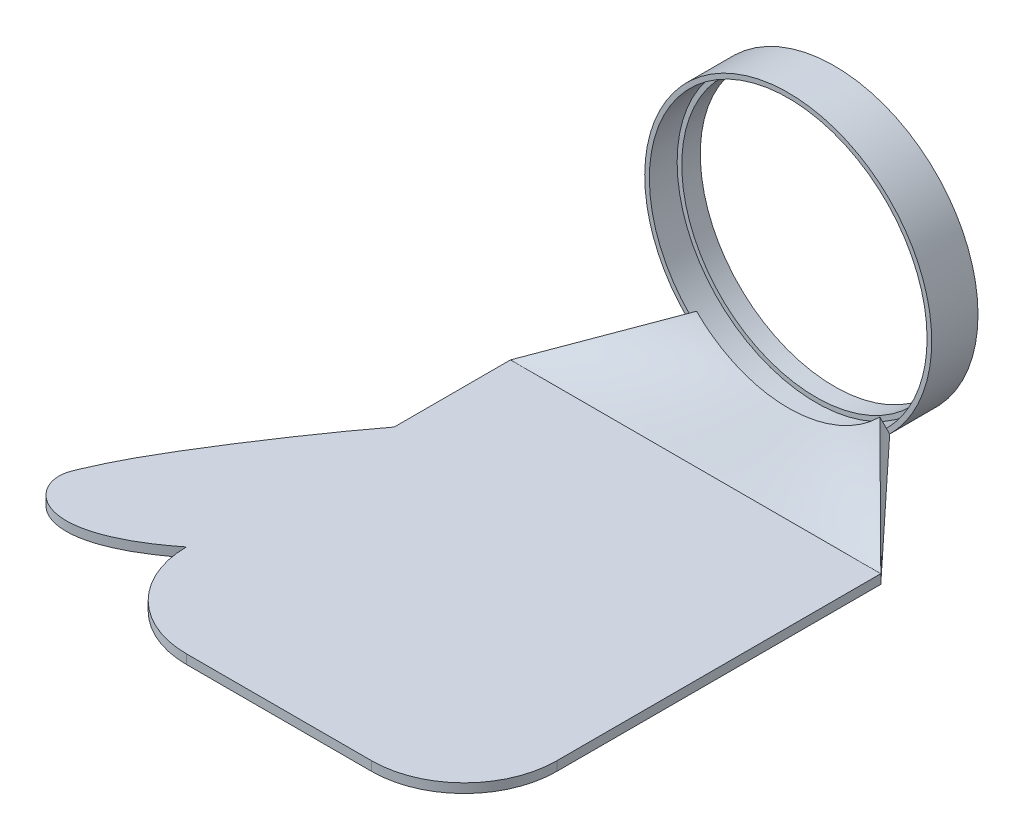
ISO-10303-21;
HEADER;
FILE_DESCRIPTION(('STEP AP214'),'2;1');
FILE_NAME('part.step','',(''),(''),'','','');
FILE_SCHEMA(('AUTOMOTIVE_DESIGN { 1 0 10303 214 1 1 1 1 }'));
ENDSEC;
DATA;
#1=APPLICATION_CONTEXT('core data for automotive mechanical design processes');
#2=APPLICATION_PROTOCOL_DEFINITION('international standard','automotive_design',2000,#1);
#3=PRODUCT_CONTEXT('',#1,'mechanical');
#4=PRODUCT('Part','Part','',(#3));
#5=PRODUCT_RELATED_PRODUCT_CATEGORY('part','',(#4));
#6=PRODUCT_DEFINITION_FORMATION('','',#4);
#7=PRODUCT_DEFINITION_CONTEXT('part definition',#1,'design');
#8=PRODUCT_DEFINITION('design','',#6,#7);
#9=PRODUCT_DEFINITION_SHAPE('','',#8);
#10=(LENGTH_UNIT() NAMED_UNIT(*) SI_UNIT(.MILLI.,.METRE.));
#11=(NAMED_UNIT(*) PLANE_ANGLE_UNIT() SI_UNIT($,.RADIAN.));
#12=(NAMED_UNIT(*) SI_UNIT($,.STERADIAN.) SOLID_ANGLE_UNIT());
#13=UNCERTAINTY_MEASURE_WITH_UNIT(LENGTH_MEASURE(1.E-05),#10,'distance_accuracy_value','');
#14=(GEOMETRIC_REPRESENTATION_CONTEXT(3) GLOBAL_UNCERTAINTY_ASSIGNED_CONTEXT((#13)) GLOBAL_UNIT_ASSIGNED_CONTEXT((#10,
#11,#12)) REPRESENTATION_CONTEXT('',''));
#15=CARTESIAN_POINT('',(0.,0.,0.));
#16=DIRECTION('',(0.,0.,1.));
#17=DIRECTION('',(1.,0.,0.));
#18=AXIS2_PLACEMENT_3D('',#15,#16,#17);
#19=CARTESIAN_POINT('',(0.,0.,5.));
#20=DIRECTION('',(0.,0.,1.));
#21=DIRECTION('',(1.,0.,0.));
#22=AXIS2_PLACEMENT_3D('',#19,#20,#21);
#23=PLANE('',#22);
#24=CARTESIAN_POINT('',(10.9601551083915,-10.9601551083915,5.));
#25=CARTESIAN_POINT('',(11.1396797140786,-10.7806732913506,5.));
#26=CARTESIAN_POINT('',(11.3148051119656,-10.5967872776614,5.));
#27=CARTESIAN_POINT('',(11.6554248805663,-10.2210508058151,5.));
#28=CARTESIAN_POINT('',(11.820939900256,-10.0292190651756,5.));
#29=CARTESIAN_POINT('',(12.1423419068784,-9.63759345242739,5.));
#30=CARTESIAN_POINT('',(12.298227138055,-9.43779813921744,5.));
#31=CARTESIAN_POINT('',(12.600400333795,-9.030273703139,5.));
#32=CARTESIAN_POINT('',(12.7466622748356,-8.82252529182297,5.));
#33=CARTESIAN_POINT('',(13.0288191444432,-8.40026650995938,5.));
#34=CARTESIAN_POINT('',(13.1647196545231,-8.18575986922739,5.));
#35=CARTESIAN_POINT('',(13.425502533184,-7.75079971758814,5.));
#36=CARTESIAN_POINT('',(13.5504088466001,-7.53036056821244,5.));
#37=CARTESIAN_POINT('',(13.7892300068208,-7.08355529698752,5.));
#38=CARTESIAN_POINT('',(13.9031428513517,-6.85718810495524,5.));
#39=CARTESIAN_POINT('',(14.1200065590072,-6.39854366498906,5.));
#40=CARTESIAN_POINT('',(14.2229281322285,-6.16625257349241,5.));
#41=CARTESIAN_POINT('',(14.4172846377865,-5.69706114298184,5.));
#42=CARTESIAN_POINT('',(14.5087257718417,-5.46016337306585,5.));
#43=CARTESIAN_POINT('',(14.6796412941002,-4.98268468083537,5.));
#44=CARTESIAN_POINT('',(14.7591419691489,-4.742113172878,5.));
#45=CARTESIAN_POINT('',(14.9062069418913,-4.25730144905169,5.));
#46=CARTESIAN_POINT('',(14.9737690670359,-4.01306057419636,5.));
#47=CARTESIAN_POINT('',(15.0969883642954,-3.52092078428873,5.));
#48=CARTESIAN_POINT('',(15.1526141069755,-3.27301400553592,5.));
#49=CARTESIAN_POINT('',(15.2517094701977,-2.77488709154146,5.));
#50=CARTESIAN_POINT('',(15.2951840157062,-2.52466793612694,5.));
#51=CARTESIAN_POINT('',(15.3696725891579,-2.02297442055554,5.));
#52=CARTESIAN_POINT('',(15.4007153621291,-1.77150433318205,5.));
#53=CARTESIAN_POINT('',(15.4503728172029,-1.26731712465585,5.));
#54=CARTESIAN_POINT('',(15.4689863696468,-1.01459989225569,5.));
#55=CARTESIAN_POINT('',(15.4938162589252,-0.507922784482301,5.));
#56=CARTESIAN_POINT('',(15.5000013359242,-0.253961382273287,5.));
#57=CARTESIAN_POINT('',(15.4999986644409,0.253891979022556,5.));
#58=CARTESIAN_POINT('',(15.4938142967758,0.50778393812028,5.));
#59=CARTESIAN_POINT('',(15.4689860677092,1.01436850617498,5.));
#60=CARTESIAN_POINT('',(15.4503711953102,1.26706253115691,5.));
#61=CARTESIAN_POINT('',(15.400712470744,1.77124941542882,5.));
#62=CARTESIAN_POINT('',(15.3696674888441,2.02274216343561,5.));
#63=CARTESIAN_POINT('',(15.2951824647361,2.52452863580036,5.));
#64=CARTESIAN_POINT('',(15.2517115025878,2.77481776539001,5.));
#65=CARTESIAN_POINT('',(15.1526523031044,3.27288108926576,5.));
#66=CARTESIAN_POINT('',(15.0970689925711,3.52065626336321,5.));
#67=CARTESIAN_POINT('',(14.9739067825486,4.01262080627993,5.));
#68=CARTESIAN_POINT('',(14.9063549686672,4.25681695123904,5.));
#69=CARTESIAN_POINT('',(14.7592880677599,4.74162806923374,5.));
#70=CARTESIAN_POINT('',(14.6797708081554,4.98224238317566,5.));
#71=CARTESIAN_POINT('',(14.5088059942086,5.45989877096893,5.));
#72=CARTESIAN_POINT('',(14.4173279399969,5.69692992263598,5.));
#73=CARTESIAN_POINT('',(14.2229903005675,6.1661291654081,5.));
#74=CARTESIAN_POINT('',(14.1201369172639,6.39829982516878,5.));
#75=CARTESIAN_POINT('',(13.9033640406105,6.85678378510566,5.));
#76=CARTESIAN_POINT('',(13.7894697917361,7.0831090158759,5.));
#77=CARTESIAN_POINT('',(13.550646695384,7.52991325952517,5.));
#78=CARTESIAN_POINT('',(13.4257158456836,7.750391202137,5.));
#79=CARTESIAN_POINT('',(13.1648499577192,8.18551598532972,5.));
#80=CARTESIAN_POINT('',(13.028887136339,8.40014616332075,5.));
#81=CARTESIAN_POINT('',(12.7467474024887,8.82241647898493,5.));
#82=CARTESIAN_POINT('',(12.6005760716388,9.03006034588864,5.));
#83=CARTESIAN_POINT('',(12.2985226433296,9.43744437546974,5.));
#84=CARTESIAN_POINT('',(12.1426629777432,9.63720116445356,5.));
#85=CARTESIAN_POINT('',(11.8212616159975,10.0288281148907,5.));
#86=CARTESIAN_POINT('',(11.6557181648867,10.2206968360275,5.));
#87=CARTESIAN_POINT('',(11.3149761078628,10.5965684084857,5.));
#88=CARTESIAN_POINT('',(11.1397535033878,10.7805494971669,5.));
#89=CARTESIAN_POINT('',(10.7806541535186,11.1396632755775,5.));
#90=CARTESIAN_POINT('',(10.5967821549586,11.3148007118015,5.));
#91=CARTESIAN_POINT('',(10.2210559170731,11.6554292708934,5.));
#92=CARTESIAN_POINT('',(10.0292204349668,11.8209410768391,5.));
#93=CARTESIAN_POINT('',(9.63759208239179,12.1423407300768,5.));
#94=CARTESIAN_POINT('',(9.4377977716841,12.2982268223533,5.));
#95=CARTESIAN_POINT('',(9.03027407163186,12.6004006503146,5.));
#96=CARTESIAN_POINT('',(8.82252539053157,12.746662359635,5.));
#97=CARTESIAN_POINT('',(8.40026641130496,13.0288190596895,5.));
#98=CARTESIAN_POINT('',(8.18575984280865,13.164719631777,5.));
#99=CARTESIAN_POINT('',(7.75079974394779,13.4255025558806,5.));
#100=CARTESIAN_POINT('',(7.53036057531935,13.5504088529069,5.));
#101=CARTESIAN_POINT('',(7.08355528987921,13.7892300005146,5.));
#102=CARTESIAN_POINT('',(6.85718810288884,13.903142848826,5.));
#103=CARTESIAN_POINT('',(6.39854366706075,14.1200065615408,5.));
#104=CARTESIAN_POINT('',(6.16625257464476,14.2229281360344,5.));
#105=CARTESIAN_POINT('',(5.69706114182945,14.4172846339829,5.));
#106=CARTESIAN_POINT('',(5.4601633705283,14.5087257591619,5.));
#107=CARTESIAN_POINT('',(4.98268468336393,14.6796413067518,5.));
#108=CARTESIAN_POINT('',(4.74211318184032,14.7591420159121,5.));
#109=CARTESIAN_POINT('',(4.25730144008322,14.9062068951197,5.));
#110=CARTESIAN_POINT('',(4.01306054085775,14.9737688925886,5.));
#111=CARTESIAN_POINT('',(3.52092081771079,15.0969885391967,5.));
#112=CARTESIAN_POINT('',(3.27301413038947,15.1526147604754,5.));
#113=CARTESIAN_POINT('',(2.77492100762224,15.2517020450993,5.));
#114=CARTESIAN_POINT('',(2.52473588201365,15.2951696922104,5.));
#115=CARTESIAN_POINT('',(2.02308784472048,15.3696496746441,5.));
#116=CARTESIAN_POINT('',(1.77162903819121,15.40068962827,5.));
#117=CARTESIAN_POINT('',(1.26744188346732,15.4503466182445,5.));
#118=CARTESIAN_POINT('',(1.01471331279208,15.4689613951971,5.));
#119=CARTESIAN_POINT('',(0.507990955891537,15.4938017137811,5.));
#120=CARTESIAN_POINT('',(0.253995588630871,15.4999948973562,5.));
#121=CARTESIAN_POINT('',(-0.253857784714123,15.5000050998754,5.));
#122=CARTESIAN_POINT('',(-0.50771579055831,15.4938288316171,5.));
#123=CARTESIAN_POINT('',(-1.01425512523439,15.4690110249383,5.));
#124=CARTESIAN_POINT('',(-1.26693781585405,15.4503973750194,5.));
#125=CARTESIAN_POINT('',(-1.77112475394009,15.400738185484,5.));
#126=CARTESIAN_POINT('',(-2.02262877882591,15.3696903864815,5.));
#127=CARTESIAN_POINT('',(-2.52446071347772,15.2951967775288,5.));
#128=CARTESIAN_POINT('',(-2.77478386115629,15.2517189228287,5.));
#129=CARTESIAN_POINT('',(-3.27288096475047,15.1526516511668,5.));
#130=CARTESIAN_POINT('',(-3.52065623003236,15.0970688180648,5.));
#131=CARTESIAN_POINT('',(-4.01262083953223,14.9739069566667,5.));
#132=CARTESIAN_POINT('',(-4.25681696014836,14.9063550153308,5.));
#133=CARTESIAN_POINT('',(-4.74162806031721,14.7592880210902,5.));
#134=CARTESIAN_POINT('',(-4.98224238078186,14.6797707956362,5.));
#135=CARTESIAN_POINT('',(-5.45989877336488,14.508806006762,5.));
#136=CARTESIAN_POINT('',(-5.69692992327742,14.4173279433597,5.));
#137=CARTESIAN_POINT('',(-6.16612916476628,14.2229902972069,5.));
#138=CARTESIAN_POINT('',(-6.39829982499703,14.1201369163643,5.));
#139=CARTESIAN_POINT('',(-6.85678378527719,13.903364041508,5.));
#140=CARTESIAN_POINT('',(-7.08310901592195,13.7894697919766,5.));
#141=CARTESIAN_POINT('',(-7.52991325947933,13.5506466951433,5.));
#142=CARTESIAN_POINT('',(-7.75039120212478,13.425715845619,5.));
#143=CARTESIAN_POINT('',(-8.18551598534214,13.1648499577839,5.));
#144=CARTESIAN_POINT('',(-8.40014616332409,13.0288871363563,5.));
#145=CARTESIAN_POINT('',(-8.82241647898164,12.7467474024713,5.));
#146=CARTESIAN_POINT('',(-9.0300603458878,12.6005760716341,5.));
#147=CARTESIAN_POINT('',(-9.43744437547069,12.2985226433342,5.));
#148=CARTESIAN_POINT('',(-9.63720116445388,12.1426629777443,5.));
#149=CARTESIAN_POINT('',(-10.0288281148906,11.8212616159962,5.));
#150=CARTESIAN_POINT('',(-10.2206968360275,11.6557181648863,5.));
#151=CARTESIAN_POINT('',(-10.5965684084858,11.3149761078631,5.));
#152=CARTESIAN_POINT('',(-10.7805494971669,11.1397535033879,5.));
#153=CARTESIAN_POINT('',(-11.1396632755765,10.7806541535195,5.));
#154=CARTESIAN_POINT('',(-11.3148007117997,10.5967821549604,5.));
#155=CARTESIAN_POINT('',(-11.6554292708903,10.2210559170762,5.));
#156=CARTESIAN_POINT('',(-11.8209410768357,10.0292204349702,5.));
#157=CARTESIAN_POINT('',(-12.1423407300733,9.63759208239517,5.));
#158=CARTESIAN_POINT('',(-12.2982268223501,9.43779777168715,5.));
#159=CARTESIAN_POINT('',(-12.6004006503127,9.03027407163371,5.));
#160=CARTESIAN_POINT('',(-12.7466623596341,8.82252539053252,5.));
#161=CARTESIAN_POINT('',(-13.0288190596887,8.4002664113065,5.));
#162=CARTESIAN_POINT('',(-13.1647196317756,8.18575984281178,5.));
#163=CARTESIAN_POINT('',(-13.4255025558782,7.75079974395302,5.));
#164=CARTESIAN_POINT('',(-13.5504088529043,7.53036057532508,5.));
#165=CARTESIAN_POINT('',(-13.7892300005119,7.08355528988492,5.));
#166=CARTESIAN_POINT('',(-13.9031428488235,6.85718810289402,5.));
#167=CARTESIAN_POINT('',(-14.1200065615394,6.39854366706387,5.));
#168=CARTESIAN_POINT('',(-14.2229281360337,6.16625257464633,5.));
#169=CARTESIAN_POINT('',(-14.4172846339826,5.69706114183023,5.));
#170=CARTESIAN_POINT('',(-14.5087257591614,5.46016337052988,5.));
#171=CARTESIAN_POINT('',(-14.679641306751,4.98268468336656,5.));
#172=CARTESIAN_POINT('',(-14.7591420159112,4.7421131818432,5.));
#173=CARTESIAN_POINT('',(-14.9062068951188,4.2573014400861,5.));
#174=CARTESIAN_POINT('',(-14.9737688925877,4.01306054086036,5.));
#175=CARTESIAN_POINT('',(-15.0969885391963,3.52092081771237,5.));
#176=CARTESIAN_POINT('',(-15.1526147604752,3.27301413039027,5.));
#177=CARTESIAN_POINT('',(-15.2517020450993,2.77492100762267,5.));
#178=CARTESIAN_POINT('',(-15.2951696922104,2.5247358820145,5.));
#179=CARTESIAN_POINT('',(-15.3696496746441,2.02308784472189,5.));
#180=CARTESIAN_POINT('',(-15.40068962827,1.77162903819276,5.));
#181=CARTESIAN_POINT('',(-15.4503466182445,1.26744188346887,5.));
#182=CARTESIAN_POINT('',(-15.4689613951972,1.01471331279349,5.));
#183=CARTESIAN_POINT('',(-15.4938017137812,0.507990955892377,5.));
#184=CARTESIAN_POINT('',(-15.4999948973562,0.253995588631283,5.));
#185=CARTESIAN_POINT('',(-15.5000050998754,-0.253857784716043,5.));
#186=CARTESIAN_POINT('',(-15.4938288316171,-0.507715790562133,5.));
#187=CARTESIAN_POINT('',(-15.4690110249384,-1.01425512524086,5.));
#188=CARTESIAN_POINT('',(-15.4503973750195,-1.26693781586127,5.));
#189=CARTESIAN_POINT('',(-15.400738185484,-1.77112475394704,5.));
#190=CARTESIAN_POINT('',(-15.3696903864812,-2.02262877883185,5.));
#191=CARTESIAN_POINT('',(-15.2951967775293,-2.52446071348212,5.));
#192=CARTESIAN_POINT('',(-15.2517189228302,-2.77478386116018,5.));
#193=CARTESIAN_POINT('',(-15.1526516511647,-3.27288096474932,5.));
#194=CARTESIAN_POINT('',(-15.097068818058,-3.52065623002666,5.));
#195=CARTESIAN_POINT('',(-14.9739069566704,-4.01262083954204,5.));
#196=CARTESIAN_POINT('',(-14.9063550153497,-4.25681696017818,5.));
#197=CARTESIAN_POINT('',(-14.7592880210671,-4.74162806029306,5.));
#198=CARTESIAN_POINT('',(-14.679770795556,-4.98224238068372,5.));
#199=CARTESIAN_POINT('',(-14.5088060068394,-5.45989877346739,5.));
#200=CARTESIAN_POINT('',(-14.4173279436527,-5.69692992365548,5.));
#201=CARTESIAN_POINT('',(-14.2229902969149,-6.16612916438637,5.));
#202=CARTESIAN_POINT('',(-14.1201369152724,-6.39829982358434,5.));
#203=CARTESIAN_POINT('',(-13.9033640426049,-6.85678378667167,5.));
#204=CARTESIAN_POINT('',(-13.7894697960536,-7.08310902114547,5.));
#205=CARTESIAN_POINT('',(-13.5506466910757,-7.5299132542341,5.));
#206=CARTESIAN_POINT('',(-13.4257158304238,-7.75039118257841,5.));
#207=CARTESIAN_POINT('',(-13.1648499730259,-8.18551600492416,5.));
#208=CARTESIAN_POINT('',(-13.0288871933002,-8.40014623651187,5.));
#209=CARTESIAN_POINT('',(-12.7467473455613,-8.82241640582921,5.));
#210=CARTESIAN_POINT('',(-12.6005758592755,-9.03006007292708,5.));
#211=CARTESIAN_POINT('',(-12.2985228552264,-9.43744464781345,5.));
#212=CARTESIAN_POINT('',(-12.1426637676938,-9.63720217979763,5.));
#213=CARTESIAN_POINT('',(-11.8212608259143,-10.0288270993512,5.));
#214=CARTESIAN_POINT('',(-11.6557152162184,-10.2206930459647,5.));
#215=CARTESIAN_POINT('',(-11.3149790642104,-10.5965722084009,5.));
#216=CARTESIAN_POINT('',(-11.1397645499453,-10.7805636957848,5.));
#217=CARTESIAN_POINT('',(-10.9601551083915,-10.9601551083915,5.));
#218=B_SPLINE_CURVE_WITH_KNOTS('',3,(#24,#25,#26,#27,#28,#29,#30,#31,#32,#33,#34,#35,#36,#37,
#38,#39,#40,#41,#42,#43,#44,#45,#46,#47,#48,#49,#50,#51,#52,#53,#54,#55,#56,#57,#58,#59,#60,#61,
#62,#63,#64,#65,#66,#67,#68,#69,#70,#71,#72,#73,#74,#75,#76,#77,#78,#79,#80,#81,#82,#83,#84,#85,
#86,#87,#88,#89,#90,#91,#92,#93,#94,#95,#96,#97,#98,#99,#100,#101,#102,#103,#104,#105,#106,#107,
#108,#109,#110,#111,#112,#113,#114,#115,#116,#117,#118,#119,#120,#121,#122,#123,#124,#125,#126,
#127,#128,#129,#130,#131,#132,#133,#134,#135,#136,#137,#138,#139,#140,#141,#142,#143,#144,#145,
#146,#147,#148,#149,#150,#151,#152,#153,#154,#155,#156,#157,#158,#159,#160,#161,#162,#163,#164,
#165,#166,#167,#168,#169,#170,#171,#172,#173,#174,#175,#176,#177,#178,#179,#180,#181,#182,#183,
#184,#185,#186,#187,#188,#189,#190,#191,#192,#193,#194,#195,#196,#197,#198,#199,#200,#201,#202,
#203,#204,#205,#206,#207,#208,#209,#210,#211,#212,#213,#214,#215,#216,#217),.UNSPECIFIED.,.F.,
.F.,(4,2,2,2,2,2,2,2,2,2,2,2,2,2,2,2,2,2,2,2,2,2,2,2,2,2,2,2,2,2,2,2,2,2,2,2,2,2,2,2,2,2,2,2,2,
2,2,2,2,2,2,2,2,2,2,2,2,2,2,2,2,2,2,2,2,2,2,2,2,2,2,2,2,2,2,2,2,2,2,2,2,2,2,2,2,2,2,2,2,2,2,2,2,
2,2,2,4),(0.,0.761495825092329,1.52128984289176,2.28122198412853,3.04313117887268,
3.80462700396305,4.56442102176184,5.32435316299923,6.08626235774524,6.84775818283231,
7.60755220062999,8.3674843418685,9.1293935366179,9.89099347487502,10.6508221134894,
11.4107198014987,12.1725263875182,12.9341247849815,13.6939532437838,14.4538507766366,
15.215655896013,15.9771517211025,16.736945738901,17.4968778801387,18.2587870748857,
19.020282899982,19.7800769177828,20.5400090590182,21.3019182537584,22.0634140788532,
22.8232080966534,23.5831402378894,24.345049432631,25.1065452577206,25.8663392755191,
26.6262714167568,27.3881806115036,28.1496764365944,28.9094704543933,29.6694025956306,
30.4313117903762,31.1928076154651,31.9526016332633,32.7125337745013,33.4744429692488,
34.235938794336,34.9957328121337,35.7556649533722,36.5175741481215,37.2790699732064,
38.0388639910034,38.7987961322426,39.5607053269941,40.3222011520811,41.0819951698788,
41.8419273111173,42.6038365058668,43.3653323309632,44.1251263487641,44.8850584899995,
45.6469676847395,46.4084635098344,47.1682575276347,47.9281896688706,48.6900988636121,
49.4515946886977,50.211388706495,50.9713208477339,51.7332300424846,52.4947258675703,
53.2545198853675,54.0144520266065,54.7763612213573,55.5378570464437,56.2976510642411,
57.0575832054799,57.8194924002299,58.5809882253158,59.3407822431131,60.100714384352,
60.8626235791026,61.6241194041933,62.3839134219922,63.1438455632295,63.9057547579753,
64.667250583065,65.4270446008636,66.1869767421012,66.9488859368479,67.7103817619349,
68.4701757797326,69.2301079209711,69.9920171157205,70.7535129408091,71.5133069586072,
72.2732390998453,73.0351482945932),.UNSPECIFIED.);
#219=CARTESIAN_POINT('',(10.9601551083915,-10.9601551083915,5.));
#220=VERTEX_POINT('',#219);
#221=CARTESIAN_POINT('',(-10.9601551083915,-10.9601551083915,5.));
#222=VERTEX_POINT('',#221);
#223=EDGE_CURVE('E477',#220,#222,#218,.T.);
#224=ORIENTED_EDGE('',*,*,#223,.T.);
#225=DIRECTION('',(0.707106781186549,0.707106781186546,0.));
#226=VECTOR('',#225,1.);
#227=CARTESIAN_POINT('',(-10.9601551083915,-10.9601551083915,5.));
#228=LINE('',#227,#226);
#229=CARTESIAN_POINT('',(-10.6066017177983,-10.6066017177982,5.));
#230=VERTEX_POINT('',#229);
#231=EDGE_CURVE('E313',#222,#230,#228,.T.);
#232=ORIENTED_EDGE('',*,*,#231,.T.);
#233=CARTESIAN_POINT('',(0.,0.,5.));
#234=DIRECTION('',(0.,0.,1.));
#235=DIRECTION('',(1.,0.,0.));
#236=AXIS2_PLACEMENT_3D('',#233,#234,#235);
#237=CIRCLE('',#236,15.);
#238=CARTESIAN_POINT('',(10.6066017177982,-10.6066017177982,5.));
#239=VERTEX_POINT('',#238);
#240=EDGE_CURVE('E456',#239,#230,#237,.T.);
#241=ORIENTED_EDGE('',*,*,#240,.F.);
#242=DIRECTION('',(-0.707106781186549,0.707106781186546,0.));
#243=VECTOR('',#242,1.);
#244=CARTESIAN_POINT('',(9.89949493661169,-9.89949493661165,5.));
#245=LINE('',#244,#243);
#246=EDGE_CURVE('E337',#220,#239,#245,.T.);
#247=ORIENTED_EDGE('',*,*,#246,.F.);
#248=EDGE_LOOP('',(#224,#232,#241,#247));
#249=FACE_BOUND('',#248,.T.);
#250=ADVANCED_FACE('F59',(#249),#23,.T.);
#251=CARTESIAN_POINT('',(0.,0.,2.));
#252=DIRECTION('',(0.,0.,1.));
#253=DIRECTION('',(1.,0.,0.));
#254=AXIS2_PLACEMENT_3D('',#251,#252,#253);
#255=PLANE('',#254);
#256=CARTESIAN_POINT('',(0.,0.,2.));
#257=DIRECTION('',(0.,0.,1.));
#258=DIRECTION('',(1.,0.,0.));
#259=AXIS2_PLACEMENT_3D('',#256,#257,#258);
#260=CIRCLE('',#259,15.);
#261=CARTESIAN_POINT('',(15.,0.,2.));
#262=VERTEX_POINT('',#261);
#263=EDGE_CURVE('E408',#262,#262,#260,.T.);
#264=ORIENTED_EDGE('',*,*,#263,.T.);
#265=EDGE_LOOP('',(#264));
#266=FACE_BOUND('',#265,.T.);
#267=CARTESIAN_POINT('',(0.,0.,2.));
#268=DIRECTION('',(0.,0.,1.));
#269=DIRECTION('',(1.,0.,0.));
#270=AXIS2_PLACEMENT_3D('',#267,#268,#269);
#271=CIRCLE('',#270,14.5);
#272=CARTESIAN_POINT('',(14.5,0.,2.));
#273=VERTEX_POINT('',#272);
#274=EDGE_CURVE('E414',#273,#273,#271,.T.);
#275=ORIENTED_EDGE('',*,*,#274,.F.);
#276=EDGE_LOOP('',(#275));
#277=FACE_BOUND('',#276,.T.);
#278=ADVANCED_FACE('F435',(#266,#277),#255,.T.);
#279=CARTESIAN_POINT('',(0.,0.,0.));
#280=DIRECTION('',(0.,0.,1.));
#281=DIRECTION('',(1.,0.,0.));
#282=AXIS2_PLACEMENT_3D('',#279,#280,#281);
#283=PLANE('',#282);
#284=CARTESIAN_POINT('',(0.,0.,0.));
#285=DIRECTION('',(0.,0.,1.));
#286=DIRECTION('',(1.,0.,0.));
#287=AXIS2_PLACEMENT_3D('',#284,#285,#286);
#288=CIRCLE('',#287,14.5);
#289=CARTESIAN_POINT('',(14.5,0.,0.));
#290=VERTEX_POINT('',#289);
#291=EDGE_CURVE('E413',#290,#290,#288,.T.);
#292=ORIENTED_EDGE('',*,*,#291,.T.);
#293=EDGE_LOOP('',(#292));
#294=FACE_BOUND('',#293,.T.);
#295=CARTESIAN_POINT('',(0.,0.,0.));
#296=DIRECTION('',(0.,0.,1.));
#297=DIRECTION('',(1.,0.,0.));
#298=AXIS2_PLACEMENT_3D('',#295,#296,#297);
#299=CIRCLE('',#298,15.5);
#300=CARTESIAN_POINT('',(15.5,0.,0.));
#301=VERTEX_POINT('',#300);
#302=EDGE_CURVE('E403',#301,#301,#299,.T.);
#303=ORIENTED_EDGE('',*,*,#302,.F.);
#304=EDGE_LOOP('',(#303));
#305=FACE_BOUND('',#304,.T.);
#306=ADVANCED_FACE('F501',(#294,#305),#283,.F.);
#307=CARTESIAN_POINT('',(0.,0.,2.));
#308=DIRECTION('',(0.,0.,-1.));
#309=DIRECTION('',(-1.,0.,0.));
#310=AXIS2_PLACEMENT_3D('',#307,#308,#309);
#311=CYLINDRICAL_SURFACE('',#310,14.5);
#312=ORIENTED_EDGE('',*,*,#274,.T.);
#313=EDGE_LOOP('',(#312));
#314=FACE_BOUND('',#313,.T.);
#315=ORIENTED_EDGE('',*,*,#291,.F.);
#316=EDGE_LOOP('',(#315));
#317=FACE_BOUND('',#316,.T.);
#318=ADVANCED_FACE('F497',(#314,#317),#311,.F.);
#319=CARTESIAN_POINT('',(0.,0.,0.));
#320=DIRECTION('',(0.,0.,1.));
#321=DIRECTION('',(1.,0.,0.));
#322=AXIS2_PLACEMENT_3D('',#319,#320,#321);
#323=CYLINDRICAL_SURFACE('',#322,15.5);
#324=ORIENTED_EDGE('',*,*,#302,.T.);
#325=EDGE_LOOP('',(#324));
#326=FACE_BOUND('',#325,.T.);
#327=CARTESIAN_POINT('',(-10.9601551083915,-10.9601551083915,5.));
#328=CARTESIAN_POINT('',(-10.3143217750582,-11.6059884417248,5.));
#329=CARTESIAN_POINT('',(-9.5869234602297,-12.2185605593598,5.));
#330=CARTESIAN_POINT('',(-7.97874869642276,-13.3244847110265,5.));
#331=CARTESIAN_POINT('',(-7.09789012194973,-13.8174786751253,5.));
#332=CARTESIAN_POINT('',(-5.21460765052149,-14.6325195428517,5.));
#333=CARTESIAN_POINT('',(-4.21233119735893,-14.9541669561815,5.));
#334=CARTESIAN_POINT('',(-2.13986251075715,-15.3880418476378,5.));
#335=CARTESIAN_POINT('',(-1.07005170279716,-15.5,5.));
#336=CARTESIAN_POINT('',(1.07005170279716,-15.5,5.));
#337=CARTESIAN_POINT('',(2.13986251075715,-15.3880418476378,5.));
#338=CARTESIAN_POINT('',(4.21233119735892,-14.9541669561815,5.));
#339=CARTESIAN_POINT('',(5.2146076505215,-14.6325195428517,5.));
#340=CARTESIAN_POINT('',(7.09789012194973,-13.8174786751253,5.));
#341=CARTESIAN_POINT('',(7.97874869642276,-13.3244847110265,5.));
#342=CARTESIAN_POINT('',(9.5869234602297,-12.2185605593598,5.));
#343=CARTESIAN_POINT('',(10.3143217750582,-11.6059884417248,5.));
#344=CARTESIAN_POINT('',(10.9601551083915,-10.9601551083915,5.));
#345=B_SPLINE_CURVE_WITH_KNOTS('',3,(#327,#328,#329,#330,#331,#332,#333,#334,#335,#336,#337,
#338,#339,#340,#341,#342,#343,#344),.UNSPECIFIED.,.F.,.F.,(4,2,2,2,2,2,2,2,4),(0.,0.125,0.25,
0.375,0.5,0.625,0.75,0.875,1.),.UNSPECIFIED.);
#346=EDGE_CURVE('E409',#222,#220,#345,.T.);
#347=ORIENTED_EDGE('',*,*,#346,.F.);
#348=ORIENTED_EDGE('',*,*,#223,.F.);
#349=EDGE_LOOP('',(#347,#348));
#350=FACE_BOUND('',#349,.T.);
#351=ADVANCED_FACE('F488',(#326,#350),#323,.T.);
#352=CARTESIAN_POINT('',(0.,0.,0.));
#353=DIRECTION('',(0.,0.,1.));
#354=DIRECTION('',(1.,0.,0.));
#355=AXIS2_PLACEMENT_3D('',#352,#353,#354);
#356=CYLINDRICAL_SURFACE('',#355,15.);
#357=ORIENTED_EDGE('',*,*,#263,.F.);
#358=EDGE_LOOP('',(#357));
#359=FACE_BOUND('',#358,.T.);
#360=EDGE_CURVE('E463',#230,#239,#237,.T.);
#361=ORIENTED_EDGE('',*,*,#360,.T.);
#362=ORIENTED_EDGE('',*,*,#240,.T.);
#363=EDGE_LOOP('',(#361,#362));
#364=FACE_BOUND('',#363,.T.);
#365=ADVANCED_FACE('F437',(#359,#364),#356,.F.);
#366=CARTESIAN_POINT('',(0.,0.,5.));
#367=DIRECTION('',(0.,0.,1.));
#368=DIRECTION('',(1.,0.,0.));
#369=AXIS2_PLACEMENT_3D('',#366,#367,#368);
#370=PLANE('',#369);
#371=ORIENTED_EDGE('',*,*,#360,.F.);
#372=DIRECTION('',(-0.707106781186549,-0.707106781186546,0.));
#373=VECTOR('',#372,1.);
#374=CARTESIAN_POINT('',(-9.89949493661168,-9.89949493661165,5.));
#375=LINE('',#374,#373);
#376=CARTESIAN_POINT('',(-9.89949493661168,-9.89949493661165,5.));
#377=VERTEX_POINT('',#376);
#378=EDGE_CURVE('E447',#377,#230,#375,.T.);
#379=ORIENTED_EDGE('',*,*,#378,.F.);
#380=CARTESIAN_POINT('',(9.89949493661168,-9.89949493661165,5.));
#381=CARTESIAN_POINT('',(9.6651877032232,-10.1337539739343,5.));
#382=CARTESIAN_POINT('',(9.42256447462814,-10.3596925404403,5.));
#383=CARTESIAN_POINT('',(8.92197206059037,-10.793799907732,5.));
#384=CARTESIAN_POINT('',(8.6640051047175,-11.0019712795852,5.));
#385=CARTESIAN_POINT('',(8.13380909283577,-11.3995841177119,5.));
#386=CARTESIAN_POINT('',(7.86157291698949,-11.5890160949315,5.));
#387=CARTESIAN_POINT('',(7.30428455224136,-11.9480344471938,5.));
#388=CARTESIAN_POINT('',(7.01923083338962,-12.1176184443566,5.));
#389=CARTESIAN_POINT('',(6.38341416853355,-12.4661011316429,5.));
#390=CARTESIAN_POINT('',(6.03034046886581,-12.6407998167838,5.));
#391=CARTESIAN_POINT('',(5.31057143539806,-12.9596562411715,5.));
#392=CARTESIAN_POINT('',(4.94387456674611,-13.1038105267995,5.));
#393=CARTESIAN_POINT('',(4.38581655522484,-13.2965643085811,5.));
#394=CARTESIAN_POINT('',(4.19843091874765,-13.3569104610945,5.));
#395=CARTESIAN_POINT('',(3.82128020691005,-13.4696901932494,5.));
#396=CARTESIAN_POINT('',(3.63151514310322,-13.5221238112949,5.));
#397=CARTESIAN_POINT('',(3.24994952521618,-13.6189425174959,5.));
#398=CARTESIAN_POINT('',(3.05814901615334,-13.6633277832635,5.));
#399=CARTESIAN_POINT('',(2.6728328954102,-13.743894729427,5.));
#400=CARTESIAN_POINT('',(2.47931728622094,-13.7800764217359,4.99999999999999));
#401=CARTESIAN_POINT('',(2.09110423492956,-13.8442203433017,4.99999999999999));
#402=CARTESIAN_POINT('',(1.89640800282698,-13.8721898853086,5.));
#403=CARTESIAN_POINT('',(1.50602580626436,-13.9199455699123,5.));
#404=CARTESIAN_POINT('',(1.31033983286041,-13.9397316384241,5.));
#405=CARTESIAN_POINT('',(0.722308021636314,-13.986753316435,5.));
#406=CARTESIAN_POINT('',(0.328903545293259,-14.0016663819868,5.));
#407=CARTESIAN_POINT('',(-0.45775660071564,-13.9980341875313,5.));
#408=CARTESIAN_POINT('',(-0.851012267736727,-13.9794883584497,5.));
#409=CARTESIAN_POINT('',(-1.43859823279634,-13.9270728704504,5.));
#410=CARTESIAN_POINT('',(-1.63409859839222,-13.9054978707929,5.));
#411=CARTESIAN_POINT('',(-2.02403377933057,-13.8541683467012,5.));
#412=CARTESIAN_POINT('',(-2.21846860769654,-13.8244139224684,4.99999999999999));
#413=CARTESIAN_POINT('',(-2.60631634069822,-13.7566477754731,4.99999999999999));
#414=CARTESIAN_POINT('',(-2.79972620641337,-13.7186186872452,5.));
#415=CARTESIAN_POINT('',(-3.18475316935484,-13.6343606638028,5.));
#416=CARTESIAN_POINT('',(-3.37637025538638,-13.5881316774212,5.));
#417=CARTESIAN_POINT('',(-3.75749096445768,-13.4876403259657,5.));
#418=CARTESIAN_POINT('',(-3.94699452791382,-13.433377735024,5.));
#419=CARTESIAN_POINT('',(-4.32355321650082,-13.3169381104373,5.));
#420=CARTESIAN_POINT('',(-4.51060834108941,-13.2547610750394,5.));
#421=CARTESIAN_POINT('',(-4.88191645103249,-13.1226062185715,5.));
#422=CARTESIAN_POINT('',(-5.06616984350199,-13.0526295434049,5.));
#423=CARTESIAN_POINT('',(-5.43152933515844,-12.9049288413887,5.));
#424=CARTESIAN_POINT('',(-5.61263543289143,-12.8272048109602,5.));
#425=CARTESIAN_POINT('',(-6.15071196361909,-12.582639014486,5.));
#426=CARTESIAN_POINT('',(-6.50257392679655,-12.404356104665,5.));
#427=CARTESIAN_POINT('',(-7.12569674702521,-12.0550334339442,5.));
#428=CARTESIAN_POINT('',(-7.39972232394904,-11.8888775711852,5.));
#429=CARTESIAN_POINT('',(-7.93566683579611,-11.5381003788925,5.));
#430=CARTESIAN_POINT('',(-8.19758744971449,-11.3534816215252,5.));
#431=CARTESIAN_POINT('',(-8.70796933702232,-10.9668621064726,5.));
#432=CARTESIAN_POINT('',(-8.95643988681541,-10.7648735840245,5.));
#433=CARTESIAN_POINT('',(-9.43902782933653,-10.3443473400291,5.));
#434=CARTESIAN_POINT('',(-9.67314292186939,-10.1258069788315,5.));
#435=CARTESIAN_POINT('',(-9.89949493661168,-9.89949493661165,5.));
#436=B_SPLINE_CURVE_WITH_KNOTS('',3,(#380,#381,#382,#383,#384,#385,#386,#387,#388,#389,#390,
#391,#392,#393,#394,#395,#396,#397,#398,#399,#400,#401,#402,#403,#404,#405,#406,#407,#408,#409,
#410,#411,#412,#413,#414,#415,#416,#417,#418,#419,#420,#421,#422,#423,#424,#425,#426,#427,#428,
#429,#430,#431,#432,#433,#434,#435),.UNSPECIFIED.,.F.,.F.,(4,2,2,2,2,2,2,2,2,2,2,2,2,2,2,2,2,2,
2,2,2,2,2,2,2,2,2,4),(0.,0.993768399516778,1.98739274742112,2.98151768803347,3.97576160776214,
5.15614342295971,6.33665863138609,6.92710659633066,7.51755169539626,8.10798376285261,
8.69841497289285,9.2883188103817,9.87822798815407,11.0577894761174,12.2373710264397,
12.827291119838,13.4172039867996,14.0083670134971,14.5995337291675,15.1907170688635,
15.7819005394904,16.3729972691345,16.9640942718408,18.1458651774864,19.1065655663833,
20.0671323008291,21.0270278706247,21.9870768460791),.UNSPECIFIED.);
#437=CARTESIAN_POINT('',(9.89949493661168,-9.89949493661165,5.));
#438=VERTEX_POINT('',#437);
#439=EDGE_CURVE('E393',#438,#377,#436,.T.);
#440=ORIENTED_EDGE('',*,*,#439,.F.);
#441=EDGE_CURVE('E333',#239,#438,#245,.T.);
#442=ORIENTED_EDGE('',*,*,#441,.F.);
#443=EDGE_LOOP('',(#371,#379,#440,#442));
#444=FACE_BOUND('',#443,.T.);
#445=ADVANCED_FACE('F214',(#444),#370,.F.);
#446=CARTESIAN_POINT('',(-20.,-14.5,15.));
#447=CARTESIAN_POINT('',(-9.89949493661168,-9.89949493661165,5.));
#448=CARTESIAN_POINT('',(-18.3333333333333,-14.5,15.));
#449=CARTESIAN_POINT('',(-9.31616160327835,-10.482828269945,5.));
#450=CARTESIAN_POINT('',(-16.6666666666667,-14.5,15.));
#451=CARTESIAN_POINT('',(-8.65915667375586,-11.0361192149057,5.));
#452=CARTESIAN_POINT('',(-13.3333333333333,-14.5,15.));
#453=CARTESIAN_POINT('',(-7.2066117258012,-12.0350184486691,5.));
#454=CARTESIAN_POINT('',(-11.6666666666667,-14.5,15.));
#455=CARTESIAN_POINT('',(-6.41099752950297,-12.480303319468,5.));
#456=CARTESIAN_POINT('',(-8.33333333333336,-14.5,15.));
#457=CARTESIAN_POINT('',(-4.70996820047102,-13.2164692645112,5.));
#458=CARTESIAN_POINT('',(-6.66666666666669,-14.5,15.));
#459=CARTESIAN_POINT('',(-3.8046862427758,-13.5069895088091,5.));
#460=CARTESIAN_POINT('',(-3.33333333333336,-14.5,15.));
#461=CARTESIAN_POINT('',(-1.9327790419742,-13.8988765075438,5.));
#462=CARTESIAN_POINT('',(-1.66666666666669,-14.5,15.));
#463=CARTESIAN_POINT('',(-0.966498312203889,-14.,5.));
#464=CARTESIAN_POINT('',(1.66666666666664,-14.5,15.));
#465=CARTESIAN_POINT('',(0.966498312203893,-14.,5.));
#466=CARTESIAN_POINT('',(3.3333333333333,-14.5,15.));
#467=CARTESIAN_POINT('',(1.9327790419742,-13.8988765075438,5.));
#468=CARTESIAN_POINT('',(6.66666666666664,-14.5,15.));
#469=CARTESIAN_POINT('',(3.8046862427758,-13.5069895088091,5.));
#470=CARTESIAN_POINT('',(8.33333333333331,-14.5,15.));
#471=CARTESIAN_POINT('',(4.70996820047103,-13.2164692645112,5.));
#472=CARTESIAN_POINT('',(11.6666666666666,-14.5,15.));
#473=CARTESIAN_POINT('',(6.41099752950298,-12.480303319468,5.));
#474=CARTESIAN_POINT('',(13.3333333333333,-14.5,15.));
#475=CARTESIAN_POINT('',(7.2066117258012,-12.0350184486691,5.));
#476=CARTESIAN_POINT('',(16.6666666666667,-14.5,15.));
#477=CARTESIAN_POINT('',(8.65915667375586,-11.0361192149057,5.));
#478=CARTESIAN_POINT('',(18.3333333333333,-14.5,15.));
#479=CARTESIAN_POINT('',(9.31616160327835,-10.482828269945,5.));
#480=CARTESIAN_POINT('',(20.,-14.5,15.));
#481=CARTESIAN_POINT('',(9.89949493661168,-9.89949493661165,5.));
#482=B_SPLINE_SURFACE_WITH_KNOTS('',3,1,((#446,#447),(#448,#449),(#450,#451),(#452,#453),(#454,
#455),(#456,#457),(#458,#459),(#460,#461),(#462,#463),(#464,#465),(#466,#467),(#468,#469),(#470,
#471),(#472,#473),(#474,#475),(#476,#477),(#478,#479),(#480,#481)),.UNSPECIFIED.,.F.,.F.,.F.,(4,
2,2,2,2,2,2,2,4),(2,2),(0.,0.125,0.25,0.375,0.5,0.625,0.75,0.875,1.),(0.,1.),.UNSPECIFIED.);
#483=DIRECTION('',(-1.,0.,0.));
#484=VECTOR('',#483,1.);
#485=CARTESIAN_POINT('',(-20.,-14.5,15.));
#486=LINE('',#485,#484);
#487=CARTESIAN_POINT('',(20.,-14.5,15.));
#488=VERTEX_POINT('',#487);
#489=CARTESIAN_POINT('',(-20.,-14.5,15.));
#490=VERTEX_POINT('',#489);
#491=EDGE_CURVE('E263',#488,#490,#486,.T.);
#492=DIRECTION('',(-0.676099688474636,0.307945000835378,-0.669372159344111));
#493=VECTOR('',#492,1.);
#494=CARTESIAN_POINT('',(14.9497474683058,-12.1997474683058,10.));
#495=LINE('',#494,#493);
#496=EDGE_CURVE('E339',#488,#438,#495,.T.);
#497=DIRECTION('',(-0.676099688474637,-0.307945000835378,0.669372159344111));
#498=VECTOR('',#497,1.);
#499=CARTESIAN_POINT('',(-14.9497474683058,-12.1997474683058,10.));
#500=LINE('',#499,#498);
#501=EDGE_CURVE('E243',#377,#490,#500,.T.);
#502=ORIENTED_EDGE('',*,*,#491,.F.);
#503=ORIENTED_EDGE('',*,*,#496,.T.);
#504=ORIENTED_EDGE('',*,*,#439,.T.);
#505=ORIENTED_EDGE('',*,*,#501,.T.);
#506=EDGE_LOOP('',(#502,#503,#504,#505));
#507=FACE_BOUND('',#506,.T.);
#508=ADVANCED_FACE('F366',(#507),#482,.T.);
#509=CARTESIAN_POINT('',(20.,-14.5,15.));
#510=CARTESIAN_POINT('',(9.89949493661168,-9.89949493661164,5.));
#511=CARTESIAN_POINT('',(20.,-14.6666666666667,15.));
#512=CARTESIAN_POINT('',(10.0762716319083,-10.0762716319083,5.));
#513=CARTESIAN_POINT('',(20.,-14.8333333333334,15.));
#514=CARTESIAN_POINT('',(10.2530483272049,-10.2530483272049,5.));
#515=CARTESIAN_POINT('',(20.,-15.1666666666667,15.));
#516=CARTESIAN_POINT('',(10.6066017177982,-10.6066017177982,5.));
#517=CARTESIAN_POINT('',(20.,-15.3333333333333,15.));
#518=CARTESIAN_POINT('',(10.7833784130949,-10.7833784130948,5.));
#519=CARTESIAN_POINT('',(20.,-15.5,15.));
#520=CARTESIAN_POINT('',(10.9601551083915,-10.9601551083915,5.));
#521=B_SPLINE_SURFACE_WITH_KNOTS('',3,1,((#509,#510),(#511,#512),(#513,#514),(#515,#516),(#517,
#518),(#519,#520)),.UNSPECIFIED.,.F.,.F.,.F.,(4,2,4),(2,2),(0.,0.5,1.),(0.,1.),.UNSPECIFIED.);
#522=DIRECTION('',(0.,1.,0.));
#523=VECTOR('',#522,1.);
#524=CARTESIAN_POINT('',(20.,-15.5,15.));
#525=LINE('',#524,#523);
#526=CARTESIAN_POINT('',(20.,-15.5,15.));
#527=VERTEX_POINT('',#526);
#528=EDGE_CURVE('E244',#527,#488,#525,.T.);
#529=DIRECTION('',(-0.63552395454151,0.319162575587816,-0.703025286563771));
#530=VECTOR('',#529,1.);
#531=CARTESIAN_POINT('',(15.4800775541958,-13.2300775541957,10.));
#532=LINE('',#531,#530);
#533=EDGE_CURVE('E195',#527,#220,#532,.T.);
#534=ORIENTED_EDGE('',*,*,#528,.F.);
#535=ORIENTED_EDGE('',*,*,#533,.T.);
#536=ORIENTED_EDGE('',*,*,#246,.T.);
#537=ORIENTED_EDGE('',*,*,#441,.T.);
#538=ORIENTED_EDGE('',*,*,#496,.F.);
#539=EDGE_LOOP('',(#534,#535,#536,#537,#538));
#540=FACE_BOUND('',#539,.T.);
#541=ADVANCED_FACE('F376',(#540),#521,.T.);
#542=CARTESIAN_POINT('',(-20.,-15.5,15.));
#543=CARTESIAN_POINT('',(-10.9601551083915,-10.9601551083915,5.));
#544=CARTESIAN_POINT('',(-20.,-15.3333333333333,15.));
#545=CARTESIAN_POINT('',(-10.7833784130949,-10.7833784130948,5.));
#546=CARTESIAN_POINT('',(-20.,-15.1666666666667,15.));
#547=CARTESIAN_POINT('',(-10.6066017177982,-10.6066017177982,5.));
#548=CARTESIAN_POINT('',(-20.,-14.8333333333333,15.));
#549=CARTESIAN_POINT('',(-10.253048327205,-10.2530483272049,5.));
#550=CARTESIAN_POINT('',(-20.,-14.6666666666667,15.));
#551=CARTESIAN_POINT('',(-10.0762716319083,-10.0762716319083,5.));
#552=CARTESIAN_POINT('',(-20.,-14.5,15.));
#553=CARTESIAN_POINT('',(-9.89949493661168,-9.89949493661165,5.));
#554=B_SPLINE_SURFACE_WITH_KNOTS('',3,1,((#542,#543),(#544,#545),(#546,#547),(#548,#549),(#550,
#551),(#552,#553)),.UNSPECIFIED.,.F.,.F.,.F.,(4,2,4),(2,2),(0.,0.5,1.),(0.,1.),.UNSPECIFIED.);
#555=DIRECTION('',(0.,-1.,0.));
#556=VECTOR('',#555,1.);
#557=CARTESIAN_POINT('',(-20.,-15.5,15.));
#558=LINE('',#557,#556);
#559=CARTESIAN_POINT('',(-20.,-15.5,15.));
#560=VERTEX_POINT('',#559);
#561=EDGE_CURVE('E301',#490,#560,#558,.T.);
#562=DIRECTION('',(0.63552395454151,0.319162575587816,-0.703025286563771));
#563=VECTOR('',#562,1.);
#564=CARTESIAN_POINT('',(-15.4800775541958,-13.2300775541957,10.));
#565=LINE('',#564,#563);
#566=EDGE_CURVE('E326',#560,#222,#565,.T.);
#567=ORIENTED_EDGE('',*,*,#561,.F.);
#568=ORIENTED_EDGE('',*,*,#501,.F.);
#569=ORIENTED_EDGE('',*,*,#378,.T.);
#570=ORIENTED_EDGE('',*,*,#231,.F.);
#571=ORIENTED_EDGE('',*,*,#566,.F.);
#572=EDGE_LOOP('',(#567,#568,#569,#570,#571));
#573=FACE_BOUND('',#572,.T.);
#574=ADVANCED_FACE('F209',(#573),#554,.T.);
#575=CARTESIAN_POINT('',(20.,-15.5,15.));
#576=CARTESIAN_POINT('',(10.9601551083915,-10.9601551083915,5.));
#577=CARTESIAN_POINT('',(18.3333333333333,-15.5,15.));
#578=CARTESIAN_POINT('',(10.3143217750582,-11.6059884417248,5.));
#579=CARTESIAN_POINT('',(16.6666666666667,-15.5,15.));
#580=CARTESIAN_POINT('',(9.5869234602297,-12.2185605593598,5.));
#581=CARTESIAN_POINT('',(13.3333333333333,-15.5,15.));
#582=CARTESIAN_POINT('',(7.97874869642276,-13.3244847110265,5.));
#583=CARTESIAN_POINT('',(11.6666666666667,-15.5,15.));
#584=CARTESIAN_POINT('',(7.09789012194973,-13.8174786751253,5.));
#585=CARTESIAN_POINT('',(8.33333333333331,-15.5,15.));
#586=CARTESIAN_POINT('',(5.2146076505215,-14.6325195428517,5.));
#587=CARTESIAN_POINT('',(6.66666666666664,-15.5,15.));
#588=CARTESIAN_POINT('',(4.21233119735892,-14.9541669561815,5.));
#589=CARTESIAN_POINT('',(3.33333333333331,-15.5,15.));
#590=CARTESIAN_POINT('',(2.13986251075715,-15.3880418476378,5.));
#591=CARTESIAN_POINT('',(1.66666666666664,-15.5,15.));
#592=CARTESIAN_POINT('',(1.07005170279716,-15.5,5.));
#593=CARTESIAN_POINT('',(-1.66666666666669,-15.5,15.));
#594=CARTESIAN_POINT('',(-1.07005170279716,-15.5,5.));
#595=CARTESIAN_POINT('',(-3.33333333333335,-15.5,15.));
#596=CARTESIAN_POINT('',(-2.13986251075715,-15.3880418476378,5.));
#597=CARTESIAN_POINT('',(-6.66666666666668,-15.5,15.));
#598=CARTESIAN_POINT('',(-4.21233119735893,-14.9541669561815,5.));
#599=CARTESIAN_POINT('',(-8.33333333333335,-15.5,15.));
#600=CARTESIAN_POINT('',(-5.21460765052149,-14.6325195428517,5.));
#601=CARTESIAN_POINT('',(-11.6666666666667,-15.5,15.));
#602=CARTESIAN_POINT('',(-7.09789012194973,-13.8174786751253,5.));
#603=CARTESIAN_POINT('',(-13.3333333333333,-15.5,15.));
#604=CARTESIAN_POINT('',(-7.97874869642276,-13.3244847110265,5.));
#605=CARTESIAN_POINT('',(-16.6666666666667,-15.5,15.));
#606=CARTESIAN_POINT('',(-9.5869234602297,-12.2185605593598,5.));
#607=CARTESIAN_POINT('',(-18.3333333333333,-15.5,15.));
#608=CARTESIAN_POINT('',(-10.3143217750582,-11.6059884417248,5.));
#609=CARTESIAN_POINT('',(-20.,-15.5,15.));
#610=CARTESIAN_POINT('',(-10.9601551083915,-10.9601551083915,5.));
#611=B_SPLINE_SURFACE_WITH_KNOTS('',3,1,((#575,#576),(#577,#578),(#579,#580),(#581,#582),(#583,
#584),(#585,#586),(#587,#588),(#589,#590),(#591,#592),(#593,#594),(#595,#596),(#597,#598),(#599,
#600),(#601,#602),(#603,#604),(#605,#606),(#607,#608),(#609,#610)),.UNSPECIFIED.,.F.,.F.,.F.,(4,
2,2,2,2,2,2,2,4),(2,2),(0.,0.125,0.25,0.375,0.5,0.625,0.75,0.875,1.),(0.,1.),.UNSPECIFIED.);
#612=DIRECTION('',(1.,0.,0.));
#613=VECTOR('',#612,1.);
#614=CARTESIAN_POINT('',(-20.,-15.5,15.));
#615=LINE('',#614,#613);
#616=EDGE_CURVE('E190',#560,#527,#615,.T.);
#617=ORIENTED_EDGE('',*,*,#616,.F.);
#618=ORIENTED_EDGE('',*,*,#566,.T.);
#619=ORIENTED_EDGE('',*,*,#346,.T.);
#620=ORIENTED_EDGE('',*,*,#533,.F.);
#621=EDGE_LOOP('',(#617,#618,#619,#620));
#622=FACE_BOUND('',#621,.T.);
#623=ADVANCED_FACE('F197',(#622),#611,.T.);
#624=CARTESIAN_POINT('',(20.,-14.5,60.));
#625=DIRECTION('',(0.,-1.,0.));
#626=DIRECTION('',(0.,0.,-1.));
#627=AXIS2_PLACEMENT_3D('',#624,#625,#626);
#628=PLANE('',#627);
#629=DIRECTION('',(0.,0.,-1.));
#630=VECTOR('',#629,1.);
#631=CARTESIAN_POINT('',(-20.,-14.5,60.));
#632=LINE('',#631,#630);
#633=CARTESIAN_POINT('',(-20.,-14.5,27.5615986218149));
#634=VERTEX_POINT('',#633);
#635=EDGE_CURVE('E63',#634,#490,#632,.T.);
#636=ORIENTED_EDGE('',*,*,#635,.F.);
#637=CARTESIAN_POINT('',(-20.,-14.5,27.5615986218149));
#638=CARTESIAN_POINT('',(-23.6845802143655,-14.5,32.3804352369227));
#639=CARTESIAN_POINT('',(-30.2536136981727,-14.5,42.2867312834005));
#640=CARTESIAN_POINT('',(-33.147068254135,-14.5,48.6535211038882));
#641=CARTESIAN_POINT('',(-34.6279983459244,-14.5,52.2092384127151));
#642=CARTESIAN_POINT('',(-29.2463144807675,-14.5,57.320630675726));
#643=CARTESIAN_POINT('',(-20.,-14.5,50.));
#644=B_SPLINE_CURVE_WITH_KNOTS('',3,(#637,#638,#639,#640,#641,#642,#643),.UNSPECIFIED.,.F.,.F.,
(4,1,1,1,4),(0.,0.304772802461212,0.350399973636144,0.456271711749319,1.),.UNSPECIFIED.);
#645=CARTESIAN_POINT('',(-20.,-14.5,50.));
#646=VERTEX_POINT('',#645);
#647=EDGE_CURVE('E153',#634,#646,#644,.T.);
#648=ORIENTED_EDGE('',*,*,#647,.T.);
#649=CARTESIAN_POINT('',(-10.,-14.5,50.));
#650=DIRECTION('',(0.,-1.,0.));
#651=DIRECTION('',(0.,0.,-1.));
#652=AXIS2_PLACEMENT_3D('',#649,#650,#651);
#653=CIRCLE('',#652,10.);
#654=CARTESIAN_POINT('',(-10.,-14.5,60.));
#655=VERTEX_POINT('',#654);
#656=EDGE_CURVE('E70',#646,#655,#653,.F.);
#657=ORIENTED_EDGE('',*,*,#656,.T.);
#658=DIRECTION('',(-1.,0.,0.));
#659=VECTOR('',#658,1.);
#660=CARTESIAN_POINT('',(20.,-14.5,60.));
#661=LINE('',#660,#659);
#662=CARTESIAN_POINT('',(9.99999999999999,-14.5,60.));
#663=VERTEX_POINT('',#662);
#664=EDGE_CURVE('E176',#663,#655,#661,.T.);
#665=ORIENTED_EDGE('',*,*,#664,.F.);
#666=CARTESIAN_POINT('',(9.99999999999999,-14.5,50.));
#667=DIRECTION('',(0.,-1.,0.));
#668=DIRECTION('',(0.,0.,-1.));
#669=AXIS2_PLACEMENT_3D('',#666,#667,#668);
#670=CIRCLE('',#669,10.);
#671=CARTESIAN_POINT('',(20.,-14.5,50.));
#672=VERTEX_POINT('',#671);
#673=EDGE_CURVE('E148',#663,#672,#670,.F.);
#674=ORIENTED_EDGE('',*,*,#673,.T.);
#675=DIRECTION('',(0.,0.,-1.));
#676=VECTOR('',#675,1.);
#677=CARTESIAN_POINT('',(20.,-14.5,60.));
#678=LINE('',#677,#676);
#679=EDGE_CURVE('E183',#672,#488,#678,.T.);
#680=ORIENTED_EDGE('',*,*,#679,.T.);
#681=ORIENTED_EDGE('',*,*,#491,.T.);
#682=EDGE_LOOP('',(#636,#648,#657,#665,#674,#680,#681));
#683=FACE_BOUND('',#682,.T.);
#684=ADVANCED_FACE('F159',(#683),#628,.F.);
#685=CARTESIAN_POINT('',(-20.,-14.5,60.));
#686=DIRECTION('',(1.,0.,0.));
#687=DIRECTION('',(0.,1.,0.));
#688=AXIS2_PLACEMENT_3D('',#685,#686,#687);
#689=PLANE('',#688);
#690=DIRECTION('',(0.,0.,-1.));
#691=VECTOR('',#690,1.);
#692=CARTESIAN_POINT('',(-20.,-15.5,60.));
#693=LINE('',#692,#691);
#694=CARTESIAN_POINT('',(-20.,-15.5,27.5615986218149));
#695=VERTEX_POINT('',#694);
#696=EDGE_CURVE('E83',#695,#560,#693,.T.);
#697=ORIENTED_EDGE('',*,*,#696,.F.);
#698=DIRECTION('',(0.,1.,0.));
#699=VECTOR('',#698,1.);
#700=CARTESIAN_POINT('',(-20.,-15.5,27.5615986218149));
#701=LINE('',#700,#699);
#702=EDGE_CURVE('E78',#695,#634,#701,.T.);
#703=ORIENTED_EDGE('',*,*,#702,.T.);
#704=ORIENTED_EDGE('',*,*,#635,.T.);
#705=ORIENTED_EDGE('',*,*,#561,.T.);
#706=EDGE_LOOP('',(#697,#703,#704,#705));
#707=FACE_BOUND('',#706,.T.);
#708=ADVANCED_FACE('F291',(#707),#689,.F.);
#709=CARTESIAN_POINT('',(-20.,-15.5,60.));
#710=DIRECTION('',(0.,1.,0.));
#711=DIRECTION('',(0.,0.,1.));
#712=AXIS2_PLACEMENT_3D('',#709,#710,#711);
#713=PLANE('',#712);
#714=DIRECTION('',(1.,0.,0.));
#715=VECTOR('',#714,1.);
#716=CARTESIAN_POINT('',(-20.,-15.5,60.));
#717=LINE('',#716,#715);
#718=CARTESIAN_POINT('',(-10.,-15.5,60.));
#719=VERTEX_POINT('',#718);
#720=CARTESIAN_POINT('',(10.,-15.5,60.));
#721=VERTEX_POINT('',#720);
#722=EDGE_CURVE('E179',#719,#721,#717,.T.);
#723=ORIENTED_EDGE('',*,*,#722,.F.);
#724=CARTESIAN_POINT('',(-10.,-15.5,50.));
#725=DIRECTION('',(0.,1.,0.));
#726=DIRECTION('',(0.,0.,1.));
#727=AXIS2_PLACEMENT_3D('',#724,#725,#726);
#728=CIRCLE('',#727,10.);
#729=CARTESIAN_POINT('',(-20.,-15.5,50.));
#730=VERTEX_POINT('',#729);
#731=EDGE_CURVE('E157',#719,#730,#728,.F.);
#732=ORIENTED_EDGE('',*,*,#731,.T.);
#733=CARTESIAN_POINT('',(-20.,-15.5,27.5615986218149));
#734=CARTESIAN_POINT('',(-23.6845802143655,-15.5,32.3804352369227));
#735=CARTESIAN_POINT('',(-30.2536136981727,-15.5,42.2867312834005));
#736=CARTESIAN_POINT('',(-33.147068254135,-15.5,48.6535211038882));
#737=CARTESIAN_POINT('',(-34.6279983459244,-15.5,52.2092384127151));
#738=CARTESIAN_POINT('',(-29.2463144807675,-15.5,57.320630675726));
#739=CARTESIAN_POINT('',(-20.,-15.5,50.));
#740=B_SPLINE_CURVE_WITH_KNOTS('',3,(#733,#734,#735,#736,#737,#738,#739),.UNSPECIFIED.,.F.,.F.,
(4,1,1,1,4),(0.,0.304772802461212,0.350399973636144,0.456271711749319,1.),.UNSPECIFIED.);
#741=EDGE_CURVE('E155',#695,#730,#740,.T.);
#742=ORIENTED_EDGE('',*,*,#741,.F.);
#743=ORIENTED_EDGE('',*,*,#696,.T.);
#744=ORIENTED_EDGE('',*,*,#616,.T.);
#745=DIRECTION('',(0.,0.,-1.));
#746=VECTOR('',#745,1.);
#747=CARTESIAN_POINT('',(20.,-15.5,60.));
#748=LINE('',#747,#746);
#749=CARTESIAN_POINT('',(20.,-15.5,50.));
#750=VERTEX_POINT('',#749);
#751=EDGE_CURVE('E253',#750,#527,#748,.T.);
#752=ORIENTED_EDGE('',*,*,#751,.F.);
#753=CARTESIAN_POINT('',(10.,-15.5,50.));
#754=DIRECTION('',(0.,1.,0.));
#755=DIRECTION('',(0.,0.,1.));
#756=AXIS2_PLACEMENT_3D('',#753,#754,#755);
#757=CIRCLE('',#756,10.);
#758=EDGE_CURVE('E316',#750,#721,#757,.F.);
#759=ORIENTED_EDGE('',*,*,#758,.T.);
#760=EDGE_LOOP('',(#723,#732,#742,#743,#744,#752,#759));
#761=FACE_BOUND('',#760,.T.);
#762=ADVANCED_FACE('F286',(#761),#713,.F.);
#763=CARTESIAN_POINT('',(20.,-15.5,60.));
#764=DIRECTION('',(-1.,0.,0.));
#765=DIRECTION('',(0.,-1.,0.));
#766=AXIS2_PLACEMENT_3D('',#763,#764,#765);
#767=PLANE('',#766);
#768=ORIENTED_EDGE('',*,*,#679,.F.);
#769=DIRECTION('',(0.,1.,0.));
#770=VECTOR('',#769,1.);
#771=CARTESIAN_POINT('',(20.,-15.5,50.));
#772=LINE('',#771,#770);
#773=EDGE_CURVE('E12',#672,#750,#772,.F.);
#774=ORIENTED_EDGE('',*,*,#773,.T.);
#775=ORIENTED_EDGE('',*,*,#751,.T.);
#776=ORIENTED_EDGE('',*,*,#528,.T.);
#777=EDGE_LOOP('',(#768,#774,#775,#776));
#778=FACE_BOUND('',#777,.T.);
#779=ADVANCED_FACE('F276',(#778),#767,.F.);
#780=CARTESIAN_POINT('',(0.,0.,60.));
#781=DIRECTION('',(0.,0.,1.));
#782=DIRECTION('',(1.,0.,0.));
#783=AXIS2_PLACEMENT_3D('',#780,#781,#782);
#784=PLANE('',#783);
#785=ORIENTED_EDGE('',*,*,#664,.T.);
#786=DIRECTION('',(0.,-1.,0.));
#787=VECTOR('',#786,1.);
#788=CARTESIAN_POINT('',(-10.,-15.5,60.));
#789=LINE('',#788,#787);
#790=EDGE_CURVE('E142',#655,#719,#789,.T.);
#791=ORIENTED_EDGE('',*,*,#790,.T.);
#792=ORIENTED_EDGE('',*,*,#722,.T.);
#793=DIRECTION('',(0.,1.,0.));
#794=VECTOR('',#793,1.);
#795=CARTESIAN_POINT('',(9.99999999999999,-14.5000000000001,60.));
#796=LINE('',#795,#794);
#797=EDGE_CURVE('E309',#721,#663,#796,.T.);
#798=ORIENTED_EDGE('',*,*,#797,.T.);
#799=EDGE_LOOP('',(#785,#791,#792,#798));
#800=FACE_BOUND('',#799,.T.);
#801=ADVANCED_FACE('F285',(#800),#784,.T.);
#802=CARTESIAN_POINT('',(-10.0000000000001,0.,50.));
#803=DIRECTION('',(0.,1.,0.));
#804=DIRECTION('',(-1.,0.,0.));
#805=AXIS2_PLACEMENT_3D('',#802,#803,#804);
#806=CYLINDRICAL_SURFACE('',#805,10.);
#807=ORIENTED_EDGE('',*,*,#656,.F.);
#808=DIRECTION('',(0.,-1.,0.));
#809=VECTOR('',#808,1.);
#810=CARTESIAN_POINT('',(-20.,-14.5,50.));
#811=LINE('',#810,#809);
#812=EDGE_CURVE('E139',#730,#646,#811,.F.);
#813=ORIENTED_EDGE('',*,*,#812,.F.);
#814=ORIENTED_EDGE('',*,*,#731,.F.);
#815=ORIENTED_EDGE('',*,*,#790,.F.);
#816=EDGE_LOOP('',(#807,#813,#814,#815));
#817=FACE_BOUND('',#816,.T.);
#818=ADVANCED_FACE('F138',(#817),#806,.T.);
#819=CARTESIAN_POINT('',(9.9999999999999,0.,50.));
#820=DIRECTION('',(0.,-1.,0.));
#821=DIRECTION('',(1.,0.,0.));
#822=AXIS2_PLACEMENT_3D('',#819,#820,#821);
#823=CYLINDRICAL_SURFACE('',#822,10.);
#824=ORIENTED_EDGE('',*,*,#758,.F.);
#825=ORIENTED_EDGE('',*,*,#773,.F.);
#826=ORIENTED_EDGE('',*,*,#673,.F.);
#827=ORIENTED_EDGE('',*,*,#797,.F.);
#828=EDGE_LOOP('',(#824,#825,#826,#827));
#829=FACE_BOUND('',#828,.T.);
#830=ADVANCED_FACE('F61',(#829),#823,.T.);
#831=DIRECTION('',(0.,1.,0.));
#832=VECTOR('',#831,1.);
#833=SURFACE_OF_LINEAR_EXTRUSION('',#740,#832);
#834=ORIENTED_EDGE('',*,*,#647,.F.);
#835=ORIENTED_EDGE('',*,*,#702,.F.);
#836=ORIENTED_EDGE('',*,*,#741,.T.);
#837=ORIENTED_EDGE('',*,*,#812,.T.);
#838=EDGE_LOOP('',(#834,#835,#836,#837));
#839=FACE_BOUND('',#838,.T.);
#840=ADVANCED_FACE('F152',(#839),#833,.T.);
#841=CLOSED_SHELL('',(#250,#278,#306,#318,#351,#365,#445,#508,#541,#574,#623,#684,#708,#762,
#779,#801,#818,#830,#840));
#842=MANIFOLD_SOLID_BREP('B2',#841);
#843=ADVANCED_BREP_SHAPE_REPRESENTATION('',(#18,#842),#14);
#844=SHAPE_DEFINITION_REPRESENTATION(#9,#843);
ENDSEC;
END-ISO-10303-21;
